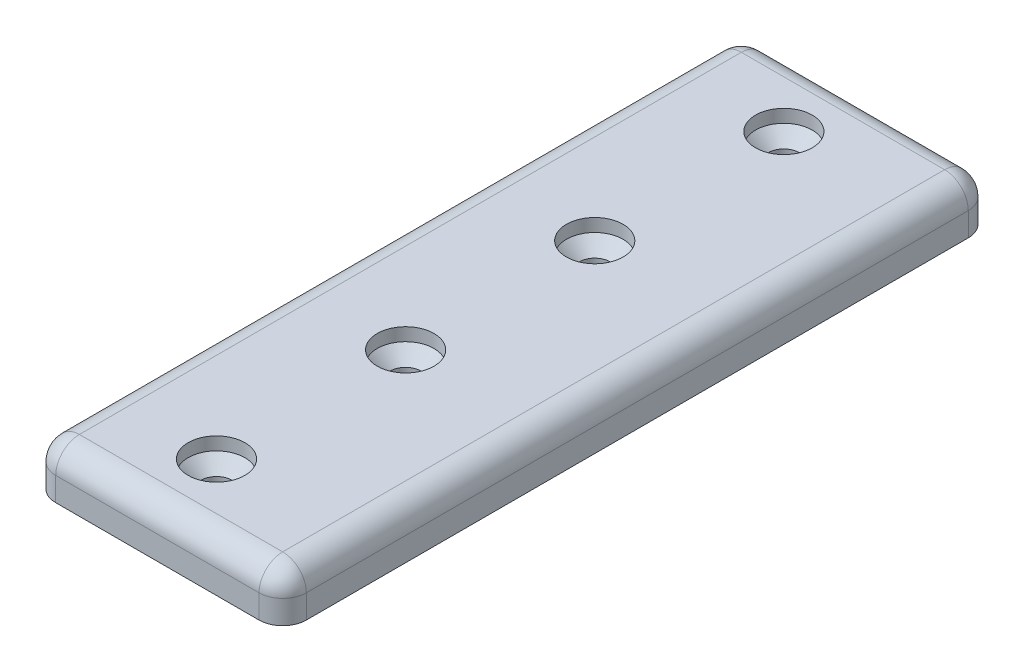
ISO-10303-21;
HEADER;
FILE_DESCRIPTION(('STEP AP214'),'2;1');
FILE_NAME('part.step','',(''),(''),'','','');
FILE_SCHEMA(('AUTOMOTIVE_DESIGN { 1 0 10303 214 1 1 1 1 }'));
ENDSEC;
DATA;
#1=APPLICATION_CONTEXT('core data for automotive mechanical design processes');
#2=APPLICATION_PROTOCOL_DEFINITION('international standard','automotive_design',2000,#1);
#3=PRODUCT_CONTEXT('',#1,'mechanical');
#4=PRODUCT('Part','Part','',(#3));
#5=PRODUCT_RELATED_PRODUCT_CATEGORY('part','',(#4));
#6=PRODUCT_DEFINITION_FORMATION('','',#4);
#7=PRODUCT_DEFINITION_CONTEXT('part definition',#1,'design');
#8=PRODUCT_DEFINITION('design','',#6,#7);
#9=PRODUCT_DEFINITION_SHAPE('','',#8);
#10=(LENGTH_UNIT() NAMED_UNIT(*) SI_UNIT(.MILLI.,.METRE.));
#11=(NAMED_UNIT(*) PLANE_ANGLE_UNIT() SI_UNIT($,.RADIAN.));
#12=(NAMED_UNIT(*) SI_UNIT($,.STERADIAN.) SOLID_ANGLE_UNIT());
#13=UNCERTAINTY_MEASURE_WITH_UNIT(LENGTH_MEASURE(1.E-05),#10,'distance_accuracy_value','');
#14=(GEOMETRIC_REPRESENTATION_CONTEXT(3) GLOBAL_UNCERTAINTY_ASSIGNED_CONTEXT((#13)) GLOBAL_UNIT_ASSIGNED_CONTEXT((#10,
#11,#12)) REPRESENTATION_CONTEXT('',''));
#15=CARTESIAN_POINT('',(0.,0.,0.));
#16=DIRECTION('',(0.,0.,1.));
#17=DIRECTION('',(1.,0.,0.));
#18=AXIS2_PLACEMENT_3D('',#15,#16,#17);
#19=CARTESIAN_POINT('',(29.,0.,230.));
#20=DIRECTION('',(-1.,0.,0.));
#21=DIRECTION('',(0.,0.,1.));
#22=AXIS2_PLACEMENT_3D('',#19,#20,#21);
#23=PLANE('',#22);
#24=DIRECTION('',(0.,0.,-1.));
#25=VECTOR('',#24,1.);
#26=CARTESIAN_POINT('',(29.,25.2,230.));
#27=LINE('',#26,#25);
#28=CARTESIAN_POINT('',(29.,25.2,145.));
#29=VERTEX_POINT('',#28);
#30=CARTESIAN_POINT('',(29.,25.2,5.));
#31=VERTEX_POINT('',#30);
#32=EDGE_CURVE('E124',#29,#31,#27,.T.);
#33=ORIENTED_EDGE('',*,*,#32,.T.);
#34=DIRECTION('',(0.,1.,0.));
#35=VECTOR('',#34,1.);
#36=CARTESIAN_POINT('',(29.,0.,5.));
#37=LINE('',#36,#35);
#38=CARTESIAN_POINT('',(29.,30.2,5.));
#39=VERTEX_POINT('',#38);
#40=EDGE_CURVE('E131',#31,#39,#37,.T.);
#41=ORIENTED_EDGE('',*,*,#40,.T.);
#42=DIRECTION('',(0.,0.,-1.));
#43=VECTOR('',#42,1.);
#44=CARTESIAN_POINT('',(29.,30.2,150.));
#45=LINE('',#44,#43);
#46=CARTESIAN_POINT('',(29.,30.2,145.));
#47=VERTEX_POINT('',#46);
#48=EDGE_CURVE('E129',#39,#47,#45,.F.);
#49=ORIENTED_EDGE('',*,*,#48,.T.);
#50=DIRECTION('',(0.,1.,0.));
#51=VECTOR('',#50,1.);
#52=CARTESIAN_POINT('',(29.,0.,145.));
#53=LINE('',#52,#51);
#54=EDGE_CURVE('E119',#47,#29,#53,.F.);
#55=ORIENTED_EDGE('',*,*,#54,.T.);
#56=EDGE_LOOP('',(#33,#41,#49,#55));
#57=FACE_BOUND('',#56,.T.);
#58=ADVANCED_FACE('F43',(#57),#23,.F.);
#59=CARTESIAN_POINT('',(0.,25.2,230.));
#60=DIRECTION('',(0.,-1.,0.));
#61=DIRECTION('',(1.,0.,0.));
#62=AXIS2_PLACEMENT_3D('',#59,#60,#61);
#63=PLANE('',#62);
#64=CARTESIAN_POINT('',(0.,25.2,135.));
#65=DIRECTION('',(0.,-1.,0.));
#66=DIRECTION('',(1.,0.,0.));
#67=AXIS2_PLACEMENT_3D('',#64,#65,#66);
#68=CIRCLE('',#67,3.25);
#69=CARTESIAN_POINT('',(3.25,25.2,135.));
#70=VERTEX_POINT('',#69);
#71=EDGE_CURVE('E241',#70,#70,#68,.T.);
#72=ORIENTED_EDGE('',*,*,#71,.F.);
#73=EDGE_LOOP('',(#72));
#74=FACE_BOUND('',#73,.T.);
#75=CARTESIAN_POINT('',(0.,25.2,95.));
#76=DIRECTION('',(0.,-1.,0.));
#77=DIRECTION('',(1.,0.,0.));
#78=AXIS2_PLACEMENT_3D('',#75,#76,#77);
#79=CIRCLE('',#78,3.25);
#80=CARTESIAN_POINT('',(3.25,25.2,95.));
#81=VERTEX_POINT('',#80);
#82=EDGE_CURVE('E240',#81,#81,#79,.T.);
#83=ORIENTED_EDGE('',*,*,#82,.F.);
#84=EDGE_LOOP('',(#83));
#85=FACE_BOUND('',#84,.T.);
#86=CARTESIAN_POINT('',(0.,25.2,55.));
#87=DIRECTION('',(0.,-1.,0.));
#88=DIRECTION('',(1.,0.,0.));
#89=AXIS2_PLACEMENT_3D('',#86,#87,#88);
#90=CIRCLE('',#89,3.25);
#91=CARTESIAN_POINT('',(3.25,25.2,55.));
#92=VERTEX_POINT('',#91);
#93=EDGE_CURVE('E231',#92,#92,#90,.T.);
#94=ORIENTED_EDGE('',*,*,#93,.F.);
#95=EDGE_LOOP('',(#94));
#96=FACE_BOUND('',#95,.T.);
#97=CARTESIAN_POINT('',(0.,25.2,15.));
#98=DIRECTION('',(0.,-1.,0.));
#99=DIRECTION('',(1.,0.,0.));
#100=AXIS2_PLACEMENT_3D('',#97,#98,#99);
#101=CIRCLE('',#100,3.25);
#102=CARTESIAN_POINT('',(3.25,25.2,15.));
#103=VERTEX_POINT('',#102);
#104=EDGE_CURVE('E230',#103,#103,#101,.T.);
#105=ORIENTED_EDGE('',*,*,#104,.F.);
#106=EDGE_LOOP('',(#105));
#107=FACE_BOUND('',#106,.T.);
#108=DIRECTION('',(-1.,0.,0.));
#109=VECTOR('',#108,1.);
#110=CARTESIAN_POINT('',(34.,25.2,0.));
#111=LINE('',#110,#109);
#112=CARTESIAN_POINT('',(24.,25.2,0.));
#113=VERTEX_POINT('',#112);
#114=CARTESIAN_POINT('',(-19.,25.2,0.));
#115=VERTEX_POINT('',#114);
#116=EDGE_CURVE('E225',#113,#115,#111,.T.);
#117=ORIENTED_EDGE('',*,*,#116,.F.);
#118=CARTESIAN_POINT('',(24.,25.2,5.));
#119=DIRECTION('',(0.,-1.,0.));
#120=DIRECTION('',(1.,0.,0.));
#121=AXIS2_PLACEMENT_3D('',#118,#119,#120);
#122=CIRCLE('',#121,5.);
#123=EDGE_CURVE('E140',#113,#31,#122,.T.);
#124=ORIENTED_EDGE('',*,*,#123,.T.);
#125=ORIENTED_EDGE('',*,*,#32,.F.);
#126=CARTESIAN_POINT('',(24.,25.2,145.));
#127=DIRECTION('',(0.,-1.,0.));
#128=DIRECTION('',(1.,0.,0.));
#129=AXIS2_PLACEMENT_3D('',#126,#127,#128);
#130=CIRCLE('',#129,5.);
#131=CARTESIAN_POINT('',(24.,25.2,150.));
#132=VERTEX_POINT('',#131);
#133=EDGE_CURVE('E137',#29,#132,#130,.T.);
#134=ORIENTED_EDGE('',*,*,#133,.T.);
#135=DIRECTION('',(-1.,0.,0.));
#136=VECTOR('',#135,1.);
#137=CARTESIAN_POINT('',(-24.,25.2,150.));
#138=LINE('',#137,#136);
#139=CARTESIAN_POINT('',(-19.,25.2,150.));
#140=VERTEX_POINT('',#139);
#141=EDGE_CURVE('E145',#132,#140,#138,.T.);
#142=ORIENTED_EDGE('',*,*,#141,.T.);
#143=CARTESIAN_POINT('',(-19.,25.2,145.));
#144=DIRECTION('',(0.,-1.,0.));
#145=DIRECTION('',(1.,0.,0.));
#146=AXIS2_PLACEMENT_3D('',#143,#144,#145);
#147=CIRCLE('',#146,5.);
#148=CARTESIAN_POINT('',(-24.,25.2,145.));
#149=VERTEX_POINT('',#148);
#150=EDGE_CURVE('E146',#140,#149,#147,.T.);
#151=ORIENTED_EDGE('',*,*,#150,.T.);
#152=DIRECTION('',(0.,0.,-1.));
#153=VECTOR('',#152,1.);
#154=CARTESIAN_POINT('',(-24.,25.2,230.));
#155=LINE('',#154,#153);
#156=CARTESIAN_POINT('',(-24.,25.2,5.));
#157=VERTEX_POINT('',#156);
#158=EDGE_CURVE('E142',#149,#157,#155,.T.);
#159=ORIENTED_EDGE('',*,*,#158,.T.);
#160=CARTESIAN_POINT('',(-19.,25.2,5.));
#161=DIRECTION('',(0.,-1.,0.));
#162=DIRECTION('',(1.,0.,0.));
#163=AXIS2_PLACEMENT_3D('',#160,#161,#162);
#164=CIRCLE('',#163,5.);
#165=EDGE_CURVE('E151',#157,#115,#164,.T.);
#166=ORIENTED_EDGE('',*,*,#165,.T.);
#167=EDGE_LOOP('',(#117,#124,#125,#134,#142,#151,#159,#166));
#168=FACE_BOUND('',#167,.T.);
#169=ADVANCED_FACE('F135',(#74,#85,#96,#107,#168),#63,.T.);
#170=CARTESIAN_POINT('',(0.,35.2,230.));
#171=DIRECTION('',(0.,1.,0.));
#172=DIRECTION('',(0.,0.,1.));
#173=AXIS2_PLACEMENT_3D('',#170,#171,#172);
#174=PLANE('',#173);
#175=DIRECTION('',(0.,0.,-1.));
#176=VECTOR('',#175,1.);
#177=CARTESIAN_POINT('',(-19.,35.2,150.));
#178=LINE('',#177,#176);
#179=CARTESIAN_POINT('',(-19.,35.2,5.));
#180=VERTEX_POINT('',#179);
#181=CARTESIAN_POINT('',(-19.,35.2,145.));
#182=VERTEX_POINT('',#181);
#183=EDGE_CURVE('E164',#180,#182,#178,.F.);
#184=ORIENTED_EDGE('',*,*,#183,.T.);
#185=DIRECTION('',(-1.,0.,0.));
#186=VECTOR('',#185,1.);
#187=CARTESIAN_POINT('',(29.,35.2,145.));
#188=LINE('',#187,#186);
#189=CARTESIAN_POINT('',(24.,35.2,145.));
#190=VERTEX_POINT('',#189);
#191=EDGE_CURVE('E11',#182,#190,#188,.F.);
#192=ORIENTED_EDGE('',*,*,#191,.T.);
#193=DIRECTION('',(0.,0.,-1.));
#194=VECTOR('',#193,1.);
#195=CARTESIAN_POINT('',(24.,35.2,0.));
#196=LINE('',#195,#194);
#197=CARTESIAN_POINT('',(24.,35.2,5.));
#198=VERTEX_POINT('',#197);
#199=EDGE_CURVE('E55',#190,#198,#196,.T.);
#200=ORIENTED_EDGE('',*,*,#199,.T.);
#201=DIRECTION('',(1.,0.,0.));
#202=VECTOR('',#201,1.);
#203=CARTESIAN_POINT('',(-24.,35.2,5.));
#204=LINE('',#203,#202);
#205=EDGE_CURVE('E170',#198,#180,#204,.F.);
#206=ORIENTED_EDGE('',*,*,#205,.T.);
#207=EDGE_LOOP('',(#184,#192,#200,#206));
#208=FACE_BOUND('',#207,.T.);
#209=CARTESIAN_POINT('',(0.,35.2,15.));
#210=DIRECTION('',(0.,1.,0.));
#211=DIRECTION('',(0.,0.,1.));
#212=AXIS2_PLACEMENT_3D('',#209,#210,#211);
#213=CIRCLE('',#212,6.);
#214=CARTESIAN_POINT('',(0.,35.2,21.));
#215=VERTEX_POINT('',#214);
#216=EDGE_CURVE('E211',#215,#215,#213,.T.);
#217=ORIENTED_EDGE('',*,*,#216,.F.);
#218=EDGE_LOOP('',(#217));
#219=FACE_BOUND('',#218,.T.);
#220=CARTESIAN_POINT('',(0.,35.2,55.));
#221=DIRECTION('',(0.,1.,0.));
#222=DIRECTION('',(0.,0.,1.));
#223=AXIS2_PLACEMENT_3D('',#220,#221,#222);
#224=CIRCLE('',#223,6.);
#225=CARTESIAN_POINT('',(0.,35.2,61.));
#226=VERTEX_POINT('',#225);
#227=EDGE_CURVE('E215',#226,#226,#224,.T.);
#228=ORIENTED_EDGE('',*,*,#227,.F.);
#229=EDGE_LOOP('',(#228));
#230=FACE_BOUND('',#229,.T.);
#231=CARTESIAN_POINT('',(0.,35.2,95.));
#232=DIRECTION('',(0.,1.,0.));
#233=DIRECTION('',(0.,0.,1.));
#234=AXIS2_PLACEMENT_3D('',#231,#232,#233);
#235=CIRCLE('',#234,6.);
#236=CARTESIAN_POINT('',(0.,35.2,101.));
#237=VERTEX_POINT('',#236);
#238=EDGE_CURVE('E217',#237,#237,#235,.T.);
#239=ORIENTED_EDGE('',*,*,#238,.F.);
#240=EDGE_LOOP('',(#239));
#241=FACE_BOUND('',#240,.T.);
#242=CARTESIAN_POINT('',(0.,35.2,135.));
#243=DIRECTION('',(0.,1.,0.));
#244=DIRECTION('',(0.,0.,1.));
#245=AXIS2_PLACEMENT_3D('',#242,#243,#244);
#246=CIRCLE('',#245,6.00000000000001);
#247=CARTESIAN_POINT('',(0.,35.2,141.));
#248=VERTEX_POINT('',#247);
#249=EDGE_CURVE('E221',#248,#248,#246,.T.);
#250=ORIENTED_EDGE('',*,*,#249,.F.);
#251=EDGE_LOOP('',(#250));
#252=FACE_BOUND('',#251,.T.);
#253=ADVANCED_FACE('F300',(#208,#219,#230,#241,#252),#174,.T.);
#254=CARTESIAN_POINT('',(-24.,0.,230.));
#255=DIRECTION('',(1.,0.,0.));
#256=DIRECTION('',(0.,0.,-1.));
#257=AXIS2_PLACEMENT_3D('',#254,#255,#256);
#258=PLANE('',#257);
#259=ORIENTED_EDGE('',*,*,#158,.F.);
#260=DIRECTION('',(0.,1.,0.));
#261=VECTOR('',#260,1.);
#262=CARTESIAN_POINT('',(-24.,0.,145.));
#263=LINE('',#262,#261);
#264=CARTESIAN_POINT('',(-24.,30.2,145.));
#265=VERTEX_POINT('',#264);
#266=EDGE_CURVE('E161',#149,#265,#263,.T.);
#267=ORIENTED_EDGE('',*,*,#266,.T.);
#268=DIRECTION('',(0.,0.,-1.));
#269=VECTOR('',#268,1.);
#270=CARTESIAN_POINT('',(-24.,30.2,0.));
#271=LINE('',#270,#269);
#272=CARTESIAN_POINT('',(-24.,30.2,5.));
#273=VERTEX_POINT('',#272);
#274=EDGE_CURVE('E158',#265,#273,#271,.T.);
#275=ORIENTED_EDGE('',*,*,#274,.T.);
#276=DIRECTION('',(0.,-1.,0.));
#277=VECTOR('',#276,1.);
#278=CARTESIAN_POINT('',(-24.,0.,5.));
#279=LINE('',#278,#277);
#280=EDGE_CURVE('E163',#273,#157,#279,.T.);
#281=ORIENTED_EDGE('',*,*,#280,.T.);
#282=EDGE_LOOP('',(#259,#267,#275,#281));
#283=FACE_BOUND('',#282,.T.);
#284=ADVANCED_FACE('F327',(#283),#258,.F.);
#285=CARTESIAN_POINT('',(0.,0.,0.));
#286=DIRECTION('',(0.,0.,1.));
#287=DIRECTION('',(1.,0.,0.));
#288=AXIS2_PLACEMENT_3D('',#285,#286,#287);
#289=PLANE('',#288);
#290=DIRECTION('',(1.,0.,0.));
#291=VECTOR('',#290,1.);
#292=CARTESIAN_POINT('',(29.,30.2,0.));
#293=LINE('',#292,#291);
#294=CARTESIAN_POINT('',(-19.,30.2,0.));
#295=VERTEX_POINT('',#294);
#296=CARTESIAN_POINT('',(24.,30.2,0.));
#297=VERTEX_POINT('',#296);
#298=EDGE_CURVE('E266',#295,#297,#293,.T.);
#299=ORIENTED_EDGE('',*,*,#298,.T.);
#300=DIRECTION('',(0.,1.,0.));
#301=VECTOR('',#300,1.);
#302=CARTESIAN_POINT('',(24.,0.,0.));
#303=LINE('',#302,#301);
#304=EDGE_CURVE('E269',#297,#113,#303,.F.);
#305=ORIENTED_EDGE('',*,*,#304,.T.);
#306=ORIENTED_EDGE('',*,*,#116,.T.);
#307=DIRECTION('',(0.,-1.,0.));
#308=VECTOR('',#307,1.);
#309=CARTESIAN_POINT('',(-19.,0.,0.));
#310=LINE('',#309,#308);
#311=EDGE_CURVE('E263',#115,#295,#310,.F.);
#312=ORIENTED_EDGE('',*,*,#311,.T.);
#313=EDGE_LOOP('',(#299,#305,#306,#312));
#314=FACE_BOUND('',#313,.T.);
#315=ADVANCED_FACE('F273',(#314),#289,.F.);
#316=CARTESIAN_POINT('',(0.,34.7,135.));
#317=DIRECTION('',(0.,1.,0.));
#318=DIRECTION('',(0.,0.,1.));
#319=AXIS2_PLACEMENT_3D('',#316,#317,#318);
#320=CYLINDRICAL_SURFACE('',#319,6.00000000000001);
#321=CARTESIAN_POINT('',(0.,32.45,135.));
#322=DIRECTION('',(0.,1.,0.));
#323=DIRECTION('',(0.,0.,1.));
#324=AXIS2_PLACEMENT_3D('',#321,#322,#323);
#325=CIRCLE('',#324,6.00000000000001);
#326=CARTESIAN_POINT('',(0.,32.45,141.));
#327=VERTEX_POINT('',#326);
#328=EDGE_CURVE('E222',#327,#327,#325,.F.);
#329=ORIENTED_EDGE('',*,*,#328,.T.);
#330=EDGE_LOOP('',(#329));
#331=FACE_BOUND('',#330,.T.);
#332=ORIENTED_EDGE('',*,*,#249,.T.);
#333=EDGE_LOOP('',(#332));
#334=FACE_BOUND('',#333,.T.);
#335=ADVANCED_FACE('F326',(#331,#334),#320,.F.);
#336=CARTESIAN_POINT('',(0.,34.7,95.));
#337=DIRECTION('',(0.,1.,0.));
#338=DIRECTION('',(0.,0.,1.));
#339=AXIS2_PLACEMENT_3D('',#336,#337,#338);
#340=CYLINDRICAL_SURFACE('',#339,6.);
#341=CARTESIAN_POINT('',(0.,32.4499999999999,95.));
#342=DIRECTION('',(0.,1.,0.));
#343=DIRECTION('',(0.,0.,1.));
#344=AXIS2_PLACEMENT_3D('',#341,#342,#343);
#345=CIRCLE('',#344,6.);
#346=CARTESIAN_POINT('',(0.,32.4499999999999,101.));
#347=VERTEX_POINT('',#346);
#348=EDGE_CURVE('E219',#347,#347,#345,.F.);
#349=ORIENTED_EDGE('',*,*,#348,.T.);
#350=EDGE_LOOP('',(#349));
#351=FACE_BOUND('',#350,.T.);
#352=ORIENTED_EDGE('',*,*,#238,.T.);
#353=EDGE_LOOP('',(#352));
#354=FACE_BOUND('',#353,.T.);
#355=ADVANCED_FACE('F516',(#351,#354),#340,.F.);
#356=CARTESIAN_POINT('',(0.,34.7,55.));
#357=DIRECTION('',(0.,1.,0.));
#358=DIRECTION('',(0.,0.,1.));
#359=AXIS2_PLACEMENT_3D('',#356,#357,#358);
#360=CYLINDRICAL_SURFACE('',#359,6.);
#361=CARTESIAN_POINT('',(0.,32.4499999999999,55.));
#362=DIRECTION('',(0.,1.,0.));
#363=DIRECTION('',(0.,0.,1.));
#364=AXIS2_PLACEMENT_3D('',#361,#362,#363);
#365=CIRCLE('',#364,6.);
#366=CARTESIAN_POINT('',(0.,32.4499999999999,61.));
#367=VERTEX_POINT('',#366);
#368=EDGE_CURVE('E213',#367,#367,#365,.F.);
#369=ORIENTED_EDGE('',*,*,#368,.T.);
#370=EDGE_LOOP('',(#369));
#371=FACE_BOUND('',#370,.T.);
#372=ORIENTED_EDGE('',*,*,#227,.T.);
#373=EDGE_LOOP('',(#372));
#374=FACE_BOUND('',#373,.T.);
#375=ADVANCED_FACE('F507',(#371,#374),#360,.F.);
#376=CARTESIAN_POINT('',(0.,34.7,15.));
#377=DIRECTION('',(0.,1.,0.));
#378=DIRECTION('',(0.,0.,1.));
#379=AXIS2_PLACEMENT_3D('',#376,#377,#378);
#380=CYLINDRICAL_SURFACE('',#379,6.);
#381=CARTESIAN_POINT('',(0.,32.4499999999999,15.));
#382=DIRECTION('',(0.,1.,0.));
#383=DIRECTION('',(0.,0.,1.));
#384=AXIS2_PLACEMENT_3D('',#381,#382,#383);
#385=CIRCLE('',#384,6.);
#386=CARTESIAN_POINT('',(0.,32.4499999999999,21.));
#387=VERTEX_POINT('',#386);
#388=EDGE_CURVE('E209',#387,#387,#385,.F.);
#389=ORIENTED_EDGE('',*,*,#388,.T.);
#390=EDGE_LOOP('',(#389));
#391=FACE_BOUND('',#390,.T.);
#392=ORIENTED_EDGE('',*,*,#216,.T.);
#393=EDGE_LOOP('',(#392));
#394=FACE_BOUND('',#393,.T.);
#395=ADVANCED_FACE('F499',(#391,#394),#380,.F.);
#396=CARTESIAN_POINT('',(0.,-24.,15.));
#397=DIRECTION('',(0.,1.,0.));
#398=DIRECTION('',(0.,0.,1.));
#399=AXIS2_PLACEMENT_3D('',#396,#397,#398);
#400=CYLINDRICAL_SURFACE('',#399,3.25);
#401=CARTESIAN_POINT('',(0.,29.6999999999999,15.));
#402=DIRECTION('',(0.,1.,0.));
#403=DIRECTION('',(0.,0.,1.));
#404=AXIS2_PLACEMENT_3D('',#401,#402,#403);
#405=CIRCLE('',#404,3.25);
#406=CARTESIAN_POINT('',(0.,29.6999999999999,18.25));
#407=VERTEX_POINT('',#406);
#408=EDGE_CURVE('E228',#407,#407,#405,.T.);
#409=ORIENTED_EDGE('',*,*,#408,.T.);
#410=EDGE_LOOP('',(#409));
#411=FACE_BOUND('',#410,.T.);
#412=ORIENTED_EDGE('',*,*,#104,.T.);
#413=EDGE_LOOP('',(#412));
#414=FACE_BOUND('',#413,.T.);
#415=ADVANCED_FACE('F321',(#411,#414),#400,.F.);
#416=CARTESIAN_POINT('',(0.,-24.,55.));
#417=DIRECTION('',(0.,1.,0.));
#418=DIRECTION('',(0.,0.,1.));
#419=AXIS2_PLACEMENT_3D('',#416,#417,#418);
#420=CYLINDRICAL_SURFACE('',#419,3.25);
#421=CARTESIAN_POINT('',(0.,29.6999999999999,55.));
#422=DIRECTION('',(0.,1.,0.));
#423=DIRECTION('',(0.,0.,1.));
#424=AXIS2_PLACEMENT_3D('',#421,#422,#423);
#425=CIRCLE('',#424,3.25);
#426=CARTESIAN_POINT('',(0.,29.6999999999999,58.25));
#427=VERTEX_POINT('',#426);
#428=EDGE_CURVE('E229',#427,#427,#425,.T.);
#429=ORIENTED_EDGE('',*,*,#428,.T.);
#430=EDGE_LOOP('',(#429));
#431=FACE_BOUND('',#430,.T.);
#432=ORIENTED_EDGE('',*,*,#93,.T.);
#433=EDGE_LOOP('',(#432));
#434=FACE_BOUND('',#433,.T.);
#435=ADVANCED_FACE('F483',(#431,#434),#420,.F.);
#436=CARTESIAN_POINT('',(0.,-24.,95.));
#437=DIRECTION('',(0.,1.,0.));
#438=DIRECTION('',(0.,0.,1.));
#439=AXIS2_PLACEMENT_3D('',#436,#437,#438);
#440=CYLINDRICAL_SURFACE('',#439,3.25);
#441=CARTESIAN_POINT('',(0.,29.6999999999999,95.));
#442=DIRECTION('',(0.,1.,0.));
#443=DIRECTION('',(0.,0.,1.));
#444=AXIS2_PLACEMENT_3D('',#441,#442,#443);
#445=CIRCLE('',#444,3.25);
#446=CARTESIAN_POINT('',(0.,29.6999999999999,98.25));
#447=VERTEX_POINT('',#446);
#448=EDGE_CURVE('E234',#447,#447,#445,.T.);
#449=ORIENTED_EDGE('',*,*,#448,.T.);
#450=EDGE_LOOP('',(#449));
#451=FACE_BOUND('',#450,.T.);
#452=ORIENTED_EDGE('',*,*,#82,.T.);
#453=EDGE_LOOP('',(#452));
#454=FACE_BOUND('',#453,.T.);
#455=ADVANCED_FACE('F472',(#451,#454),#440,.F.);
#456=CARTESIAN_POINT('',(0.,-24.,135.));
#457=DIRECTION('',(0.,1.,0.));
#458=DIRECTION('',(0.,0.,1.));
#459=AXIS2_PLACEMENT_3D('',#456,#457,#458);
#460=CYLINDRICAL_SURFACE('',#459,3.25);
#461=CARTESIAN_POINT('',(0.,29.6999999999999,135.));
#462=DIRECTION('',(0.,1.,0.));
#463=DIRECTION('',(0.,0.,1.));
#464=AXIS2_PLACEMENT_3D('',#461,#462,#463);
#465=CIRCLE('',#464,3.25);
#466=CARTESIAN_POINT('',(0.,29.6999999999999,138.25));
#467=VERTEX_POINT('',#466);
#468=EDGE_CURVE('E238',#467,#467,#465,.T.);
#469=ORIENTED_EDGE('',*,*,#468,.T.);
#470=EDGE_LOOP('',(#469));
#471=FACE_BOUND('',#470,.T.);
#472=ORIENTED_EDGE('',*,*,#71,.T.);
#473=EDGE_LOOP('',(#472));
#474=FACE_BOUND('',#473,.T.);
#475=ADVANCED_FACE('F467',(#471,#474),#460,.F.);
#476=CARTESIAN_POINT('',(0.,29.6999999999999,135.));
#477=DIRECTION('',(0.,1.,0.));
#478=DIRECTION('',(0.,0.,1.));
#479=AXIS2_PLACEMENT_3D('',#476,#477,#478);
#480=CONICAL_SURFACE('',#479,3.25,0.785398163397443);
#481=ORIENTED_EDGE('',*,*,#328,.F.);
#482=EDGE_LOOP('',(#481));
#483=FACE_BOUND('',#482,.T.);
#484=ORIENTED_EDGE('',*,*,#468,.F.);
#485=EDGE_LOOP('',(#484));
#486=FACE_BOUND('',#485,.T.);
#487=ADVANCED_FACE('F457',(#483,#486),#480,.F.);
#488=CARTESIAN_POINT('',(0.,29.6999999999999,95.));
#489=DIRECTION('',(0.,1.,0.));
#490=DIRECTION('',(0.,0.,1.));
#491=AXIS2_PLACEMENT_3D('',#488,#489,#490);
#492=CONICAL_SURFACE('',#491,3.25,0.785398163397443);
#493=ORIENTED_EDGE('',*,*,#348,.F.);
#494=EDGE_LOOP('',(#493));
#495=FACE_BOUND('',#494,.T.);
#496=ORIENTED_EDGE('',*,*,#448,.F.);
#497=EDGE_LOOP('',(#496));
#498=FACE_BOUND('',#497,.T.);
#499=ADVANCED_FACE('F449',(#495,#498),#492,.F.);
#500=CARTESIAN_POINT('',(0.,29.6999999999999,55.));
#501=DIRECTION('',(0.,1.,0.));
#502=DIRECTION('',(0.,0.,1.));
#503=AXIS2_PLACEMENT_3D('',#500,#501,#502);
#504=CONICAL_SURFACE('',#503,3.25,0.785398163397443);
#505=ORIENTED_EDGE('',*,*,#368,.F.);
#506=EDGE_LOOP('',(#505));
#507=FACE_BOUND('',#506,.T.);
#508=ORIENTED_EDGE('',*,*,#428,.F.);
#509=EDGE_LOOP('',(#508));
#510=FACE_BOUND('',#509,.T.);
#511=ADVANCED_FACE('F437',(#507,#510),#504,.F.);
#512=CARTESIAN_POINT('',(0.,29.6999999999999,15.));
#513=DIRECTION('',(0.,1.,0.));
#514=DIRECTION('',(0.,0.,1.));
#515=AXIS2_PLACEMENT_3D('',#512,#513,#514);
#516=CONICAL_SURFACE('',#515,3.25,0.785398163397443);
#517=ORIENTED_EDGE('',*,*,#388,.F.);
#518=EDGE_LOOP('',(#517));
#519=FACE_BOUND('',#518,.T.);
#520=ORIENTED_EDGE('',*,*,#408,.F.);
#521=EDGE_LOOP('',(#520));
#522=FACE_BOUND('',#521,.T.);
#523=ADVANCED_FACE('F418',(#519,#522),#516,.F.);
#524=CARTESIAN_POINT('',(-24.,25.2,150.));
#525=DIRECTION('',(0.,0.,-1.));
#526=DIRECTION('',(-1.,0.,0.));
#527=AXIS2_PLACEMENT_3D('',#524,#525,#526);
#528=PLANE('',#527);
#529=ORIENTED_EDGE('',*,*,#141,.F.);
#530=DIRECTION('',(0.,1.,0.));
#531=VECTOR('',#530,1.);
#532=CARTESIAN_POINT('',(24.,25.2,150.));
#533=LINE('',#532,#531);
#534=CARTESIAN_POINT('',(24.,30.2,150.));
#535=VERTEX_POINT('',#534);
#536=EDGE_CURVE('E149',#132,#535,#533,.T.);
#537=ORIENTED_EDGE('',*,*,#536,.T.);
#538=DIRECTION('',(-1.,0.,0.));
#539=VECTOR('',#538,1.);
#540=CARTESIAN_POINT('',(-24.,30.2,150.));
#541=LINE('',#540,#539);
#542=CARTESIAN_POINT('',(-19.,30.2,150.));
#543=VERTEX_POINT('',#542);
#544=EDGE_CURVE('E148',#535,#543,#541,.T.);
#545=ORIENTED_EDGE('',*,*,#544,.T.);
#546=DIRECTION('',(0.,1.,0.));
#547=VECTOR('',#546,1.);
#548=CARTESIAN_POINT('',(-19.,25.2,150.));
#549=LINE('',#548,#547);
#550=EDGE_CURVE('E156',#543,#140,#549,.F.);
#551=ORIENTED_EDGE('',*,*,#550,.T.);
#552=EDGE_LOOP('',(#529,#537,#545,#551));
#553=FACE_BOUND('',#552,.T.);
#554=ADVANCED_FACE('F309',(#553),#528,.F.);
#555=CARTESIAN_POINT('',(-19.,0.,145.));
#556=DIRECTION('',(0.,1.,0.));
#557=DIRECTION('',(0.,0.,1.));
#558=AXIS2_PLACEMENT_3D('',#555,#556,#557);
#559=CYLINDRICAL_SURFACE('',#558,5.);
#560=CARTESIAN_POINT('',(-19.,30.2,145.));
#561=DIRECTION('',(0.,1.,0.));
#562=DIRECTION('',(0.,0.,1.));
#563=AXIS2_PLACEMENT_3D('',#560,#561,#562);
#564=CIRCLE('',#563,5.);
#565=EDGE_CURVE('E50',#265,#543,#564,.T.);
#566=ORIENTED_EDGE('',*,*,#565,.F.);
#567=ORIENTED_EDGE('',*,*,#266,.F.);
#568=ORIENTED_EDGE('',*,*,#150,.F.);
#569=ORIENTED_EDGE('',*,*,#550,.F.);
#570=EDGE_LOOP('',(#566,#567,#568,#569));
#571=FACE_BOUND('',#570,.T.);
#572=ADVANCED_FACE('F44',(#571),#559,.T.);
#573=CARTESIAN_POINT('',(-19.,30.2,145.));
#574=DIRECTION('',(0.,0.,1.));
#575=DIRECTION('',(1.,0.,0.));
#576=AXIS2_PLACEMENT_3D('',#573,#574,#575);
#577=SPHERICAL_SURFACE('',#576,5.);
#578=CARTESIAN_POINT('',(-19.,30.2,145.));
#579=DIRECTION('',(0.,0.,1.));
#580=DIRECTION('',(1.,0.,0.));
#581=AXIS2_PLACEMENT_3D('',#578,#579,#580);
#582=CIRCLE('',#581,5.);
#583=EDGE_CURVE('E193',#265,#182,#582,.F.);
#584=ORIENTED_EDGE('',*,*,#583,.F.);
#585=ORIENTED_EDGE('',*,*,#565,.T.);
#586=CARTESIAN_POINT('',(-19.,30.2,145.));
#587=DIRECTION('',(-1.,0.,0.));
#588=DIRECTION('',(0.,0.,1.));
#589=AXIS2_PLACEMENT_3D('',#586,#587,#588);
#590=CIRCLE('',#589,5.);
#591=EDGE_CURVE('E196',#182,#543,#590,.F.);
#592=ORIENTED_EDGE('',*,*,#591,.F.);
#593=EDGE_LOOP('',(#584,#585,#592));
#594=FACE_BOUND('',#593,.T.);
#595=ADVANCED_FACE('F303',(#594),#577,.T.);
#596=CARTESIAN_POINT('',(24.,25.2,145.));
#597=DIRECTION('',(0.,1.,0.));
#598=DIRECTION('',(0.,0.,1.));
#599=AXIS2_PLACEMENT_3D('',#596,#597,#598);
#600=CYLINDRICAL_SURFACE('',#599,5.);
#601=ORIENTED_EDGE('',*,*,#133,.F.);
#602=ORIENTED_EDGE('',*,*,#54,.F.);
#603=CARTESIAN_POINT('',(24.,30.2,145.));
#604=DIRECTION('',(0.,1.,0.));
#605=DIRECTION('',(0.,0.,1.));
#606=AXIS2_PLACEMENT_3D('',#603,#604,#605);
#607=CIRCLE('',#606,5.);
#608=EDGE_CURVE('E191',#535,#47,#607,.T.);
#609=ORIENTED_EDGE('',*,*,#608,.F.);
#610=ORIENTED_EDGE('',*,*,#536,.F.);
#611=EDGE_LOOP('',(#601,#602,#609,#610));
#612=FACE_BOUND('',#611,.T.);
#613=ADVANCED_FACE('F143',(#612),#600,.T.);
#614=CARTESIAN_POINT('',(-24.,30.2,145.));
#615=DIRECTION('',(1.,0.,0.));
#616=DIRECTION('',(0.,0.,-1.));
#617=AXIS2_PLACEMENT_3D('',#614,#615,#616);
#618=CYLINDRICAL_SURFACE('',#617,5.);
#619=ORIENTED_EDGE('',*,*,#591,.T.);
#620=ORIENTED_EDGE('',*,*,#544,.F.);
#621=CARTESIAN_POINT('',(24.,30.2,145.));
#622=DIRECTION('',(1.,0.,0.));
#623=DIRECTION('',(0.,0.,-1.));
#624=AXIS2_PLACEMENT_3D('',#621,#622,#623);
#625=CIRCLE('',#624,5.);
#626=EDGE_CURVE('E186',#190,#535,#625,.T.);
#627=ORIENTED_EDGE('',*,*,#626,.F.);
#628=ORIENTED_EDGE('',*,*,#191,.F.);
#629=EDGE_LOOP('',(#619,#620,#627,#628));
#630=FACE_BOUND('',#629,.T.);
#631=ADVANCED_FACE('F298',(#630),#618,.T.);
#632=CARTESIAN_POINT('',(-19.,30.2,230.));
#633=DIRECTION('',(0.,0.,1.));
#634=DIRECTION('',(1.,0.,0.));
#635=AXIS2_PLACEMENT_3D('',#632,#633,#634);
#636=CYLINDRICAL_SURFACE('',#635,5.);
#637=ORIENTED_EDGE('',*,*,#583,.T.);
#638=ORIENTED_EDGE('',*,*,#183,.F.);
#639=CARTESIAN_POINT('',(-19.,30.2,5.));
#640=DIRECTION('',(0.,0.,-1.));
#641=DIRECTION('',(0.,1.,0.));
#642=AXIS2_PLACEMENT_3D('',#639,#640,#641);
#643=CIRCLE('',#642,5.);
#644=EDGE_CURVE('E187',#273,#180,#643,.T.);
#645=ORIENTED_EDGE('',*,*,#644,.F.);
#646=ORIENTED_EDGE('',*,*,#274,.F.);
#647=EDGE_LOOP('',(#637,#638,#645,#646));
#648=FACE_BOUND('',#647,.T.);
#649=ADVANCED_FACE('F305',(#648),#636,.T.);
#650=CARTESIAN_POINT('',(-19.,0.,5.));
#651=DIRECTION('',(0.,-1.,0.));
#652=DIRECTION('',(0.,0.,-1.));
#653=AXIS2_PLACEMENT_3D('',#650,#651,#652);
#654=CYLINDRICAL_SURFACE('',#653,5.);
#655=ORIENTED_EDGE('',*,*,#165,.F.);
#656=ORIENTED_EDGE('',*,*,#280,.F.);
#657=CARTESIAN_POINT('',(-19.,30.2,5.));
#658=DIRECTION('',(0.,1.,0.));
#659=DIRECTION('',(0.,0.,1.));
#660=AXIS2_PLACEMENT_3D('',#657,#658,#659);
#661=CIRCLE('',#660,5.);
#662=EDGE_CURVE('E182',#295,#273,#661,.T.);
#663=ORIENTED_EDGE('',*,*,#662,.F.);
#664=ORIENTED_EDGE('',*,*,#311,.F.);
#665=EDGE_LOOP('',(#655,#656,#663,#664));
#666=FACE_BOUND('',#665,.T.);
#667=ADVANCED_FACE('F280',(#666),#654,.T.);
#668=CARTESIAN_POINT('',(24.,30.2,145.));
#669=DIRECTION('',(0.,0.,1.));
#670=DIRECTION('',(1.,0.,0.));
#671=AXIS2_PLACEMENT_3D('',#668,#669,#670);
#672=SPHERICAL_SURFACE('',#671,5.);
#673=ORIENTED_EDGE('',*,*,#626,.T.);
#674=ORIENTED_EDGE('',*,*,#608,.T.);
#675=CARTESIAN_POINT('',(24.,30.2,145.));
#676=DIRECTION('',(0.,0.,1.));
#677=DIRECTION('',(1.,0.,0.));
#678=AXIS2_PLACEMENT_3D('',#675,#676,#677);
#679=CIRCLE('',#678,5.);
#680=EDGE_CURVE('E181',#190,#47,#679,.F.);
#681=ORIENTED_EDGE('',*,*,#680,.F.);
#682=EDGE_LOOP('',(#673,#674,#681));
#683=FACE_BOUND('',#682,.T.);
#684=ADVANCED_FACE('F294',(#683),#672,.T.);
#685=CARTESIAN_POINT('',(-19.,30.2,5.));
#686=DIRECTION('',(-1.,0.,0.));
#687=DIRECTION('',(0.,0.,1.));
#688=AXIS2_PLACEMENT_3D('',#685,#686,#687);
#689=SPHERICAL_SURFACE('',#688,5.);
#690=ORIENTED_EDGE('',*,*,#662,.T.);
#691=ORIENTED_EDGE('',*,*,#644,.T.);
#692=CARTESIAN_POINT('',(-19.,30.2,5.));
#693=DIRECTION('',(-1.,0.,0.));
#694=DIRECTION('',(0.,0.,1.));
#695=AXIS2_PLACEMENT_3D('',#692,#693,#694);
#696=CIRCLE('',#695,5.);
#697=EDGE_CURVE('E178',#295,#180,#696,.F.);
#698=ORIENTED_EDGE('',*,*,#697,.F.);
#699=EDGE_LOOP('',(#690,#691,#698));
#700=FACE_BOUND('',#699,.T.);
#701=ADVANCED_FACE('F284',(#700),#689,.T.);
#702=CARTESIAN_POINT('',(24.,30.2,230.));
#703=DIRECTION('',(0.,0.,1.));
#704=DIRECTION('',(1.,0.,0.));
#705=AXIS2_PLACEMENT_3D('',#702,#703,#704);
#706=CYLINDRICAL_SURFACE('',#705,5.);
#707=ORIENTED_EDGE('',*,*,#680,.T.);
#708=ORIENTED_EDGE('',*,*,#48,.F.);
#709=CARTESIAN_POINT('',(24.,30.2,5.));
#710=DIRECTION('',(0.,0.,-1.));
#711=DIRECTION('',(-1.,0.,0.));
#712=AXIS2_PLACEMENT_3D('',#709,#710,#711);
#713=CIRCLE('',#712,5.);
#714=EDGE_CURVE('E174',#198,#39,#713,.T.);
#715=ORIENTED_EDGE('',*,*,#714,.F.);
#716=ORIENTED_EDGE('',*,*,#199,.F.);
#717=EDGE_LOOP('',(#707,#708,#715,#716));
#718=FACE_BOUND('',#717,.T.);
#719=ADVANCED_FACE('F292',(#718),#706,.T.);
#720=CARTESIAN_POINT('',(0.,30.2,5.));
#721=DIRECTION('',(-1.,0.,0.));
#722=DIRECTION('',(0.,0.,1.));
#723=AXIS2_PLACEMENT_3D('',#720,#721,#722);
#724=CYLINDRICAL_SURFACE('',#723,5.);
#725=ORIENTED_EDGE('',*,*,#697,.T.);
#726=ORIENTED_EDGE('',*,*,#205,.F.);
#727=CARTESIAN_POINT('',(24.,30.2,5.));
#728=DIRECTION('',(1.,0.,0.));
#729=DIRECTION('',(0.,0.,-1.));
#730=AXIS2_PLACEMENT_3D('',#727,#728,#729);
#731=CIRCLE('',#730,5.);
#732=EDGE_CURVE('E175',#297,#198,#731,.T.);
#733=ORIENTED_EDGE('',*,*,#732,.F.);
#734=ORIENTED_EDGE('',*,*,#298,.F.);
#735=EDGE_LOOP('',(#725,#726,#733,#734));
#736=FACE_BOUND('',#735,.T.);
#737=ADVANCED_FACE('F286',(#736),#724,.T.);
#738=CARTESIAN_POINT('',(24.,30.2,5.));
#739=DIRECTION('',(0.,1.,0.));
#740=DIRECTION('',(0.,0.,1.));
#741=AXIS2_PLACEMENT_3D('',#738,#739,#740);
#742=SPHERICAL_SURFACE('',#741,5.);
#743=ORIENTED_EDGE('',*,*,#732,.T.);
#744=ORIENTED_EDGE('',*,*,#714,.T.);
#745=CARTESIAN_POINT('',(24.,30.2,5.));
#746=DIRECTION('',(0.,1.,0.));
#747=DIRECTION('',(0.,0.,1.));
#748=AXIS2_PLACEMENT_3D('',#745,#746,#747);
#749=CIRCLE('',#748,5.);
#750=EDGE_CURVE('E167',#297,#39,#749,.F.);
#751=ORIENTED_EDGE('',*,*,#750,.F.);
#752=EDGE_LOOP('',(#743,#744,#751));
#753=FACE_BOUND('',#752,.T.);
#754=ADVANCED_FACE('F293',(#753),#742,.T.);
#755=CARTESIAN_POINT('',(24.,0.,5.));
#756=DIRECTION('',(0.,1.,0.));
#757=DIRECTION('',(0.,0.,1.));
#758=AXIS2_PLACEMENT_3D('',#755,#756,#757);
#759=CYLINDRICAL_SURFACE('',#758,5.);
#760=ORIENTED_EDGE('',*,*,#123,.F.);
#761=ORIENTED_EDGE('',*,*,#304,.F.);
#762=ORIENTED_EDGE('',*,*,#750,.T.);
#763=ORIENTED_EDGE('',*,*,#40,.F.);
#764=EDGE_LOOP('',(#760,#761,#762,#763));
#765=FACE_BOUND('',#764,.T.);
#766=ADVANCED_FACE('F290',(#765),#759,.T.);
#767=CLOSED_SHELL('',(#58,#169,#253,#284,#315,#335,#355,#375,#395,#415,#435,#455,#475,#487,#499,
#511,#523,#554,#572,#595,#613,#631,#649,#667,#684,#701,#719,#737,#754,#766));
#768=MANIFOLD_SOLID_BREP('B2',#767);
#769=ADVANCED_BREP_SHAPE_REPRESENTATION('',(#18,#768),#14);
#770=SHAPE_DEFINITION_REPRESENTATION(#9,#769);
ENDSEC;
END-ISO-10303-21;
